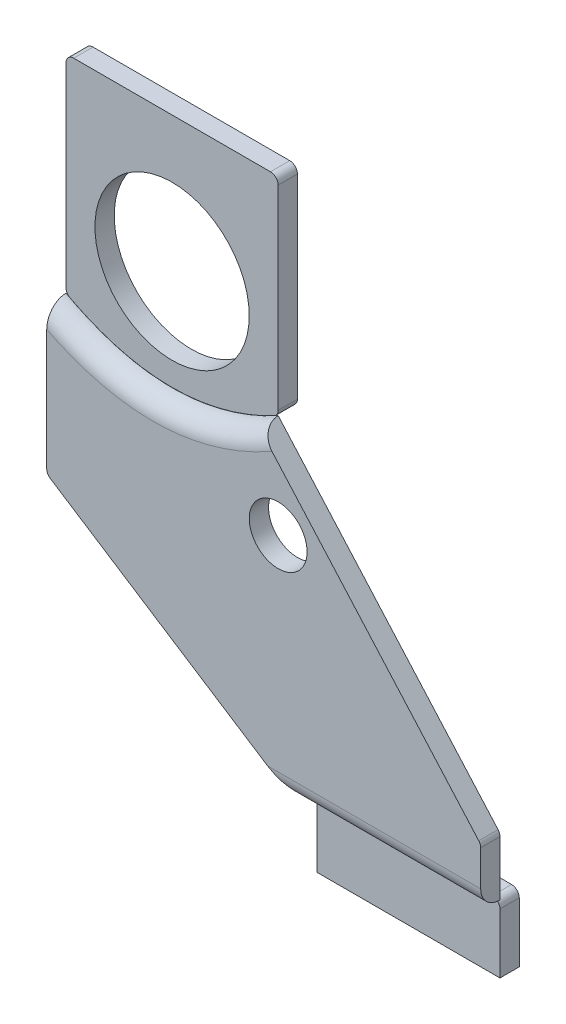
ISO-10303-21;
HEADER;
FILE_DESCRIPTION(('STEP AP214'),'2;1');
FILE_NAME('part.step','',(''),(''),'','','');
FILE_SCHEMA(('AUTOMOTIVE_DESIGN { 1 0 10303 214 1 1 1 1 }'));
ENDSEC;
DATA;
#1=APPLICATION_CONTEXT('core data for automotive mechanical design processes');
#2=APPLICATION_PROTOCOL_DEFINITION('international standard','automotive_design',2000,#1);
#3=PRODUCT_CONTEXT('',#1,'mechanical');
#4=PRODUCT('Part','Part','',(#3));
#5=PRODUCT_RELATED_PRODUCT_CATEGORY('part','',(#4));
#6=PRODUCT_DEFINITION_FORMATION('','',#4);
#7=PRODUCT_DEFINITION_CONTEXT('part definition',#1,'design');
#8=PRODUCT_DEFINITION('design','',#6,#7);
#9=PRODUCT_DEFINITION_SHAPE('','',#8);
#10=(LENGTH_UNIT() NAMED_UNIT(*) SI_UNIT(.MILLI.,.METRE.));
#11=(NAMED_UNIT(*) PLANE_ANGLE_UNIT() SI_UNIT($,.RADIAN.));
#12=(NAMED_UNIT(*) SI_UNIT($,.STERADIAN.) SOLID_ANGLE_UNIT());
#13=UNCERTAINTY_MEASURE_WITH_UNIT(LENGTH_MEASURE(1.E-05),#10,'distance_accuracy_value','');
#14=(GEOMETRIC_REPRESENTATION_CONTEXT(3) GLOBAL_UNCERTAINTY_ASSIGNED_CONTEXT((#13)) GLOBAL_UNIT_ASSIGNED_CONTEXT((#10,
#11,#12)) REPRESENTATION_CONTEXT('',''));
#15=CARTESIAN_POINT('',(0.,0.,0.));
#16=DIRECTION('',(0.,0.,1.));
#17=DIRECTION('',(1.,0.,0.));
#18=AXIS2_PLACEMENT_3D('',#15,#16,#17);
#19=CARTESIAN_POINT('',(-22.5,8.,0.));
#20=CARTESIAN_POINT('',(-11.5,2.054280429369,0.));
#21=CARTESIAN_POINT('',(-0.499999999999996,8.,0.));
#22=B_SPLINE_CURVE_WITH_KNOTS('',2,(#19,#20,#21),.UNSPECIFIED.,.F.,.F.,(3,3),(0.,1.),.UNSPECIFIED.);
#23=DIRECTION('',(0.,0.,-1.));
#24=VECTOR('',#23,1.);
#25=SURFACE_OF_LINEAR_EXTRUSION('',#22,#24);
#26=CARTESIAN_POINT('',(-22.5,8.,-2.));
#27=CARTESIAN_POINT('',(-11.5,2.054280429369,-2.));
#28=CARTESIAN_POINT('',(-0.499999999999996,8.,-2.));
#29=B_SPLINE_CURVE_WITH_KNOTS('',2,(#26,#27,#28),.UNSPECIFIED.,.F.,.F.,(3,3),(0.,1.),.UNSPECIFIED.);
#30=CARTESIAN_POINT('',(-22.0687060058506,7.77144719417887,-2.));
#31=VERTEX_POINT('',#30);
#32=CARTESIAN_POINT('',(-0.931293994149387,7.77144719417886,-2.));
#33=VERTEX_POINT('',#32);
#34=EDGE_CURVE('E137',#31,#33,#29,.T.);
#35=ORIENTED_EDGE('',*,*,#34,.T.);
#36=DIRECTION('',(0.,0.,-1.));
#37=VECTOR('',#36,1.);
#38=CARTESIAN_POINT('',(-0.931293994149414,7.77144719417885,-2.));
#39=LINE('',#38,#37);
#40=CARTESIAN_POINT('',(-0.931293994149387,7.77144719417886,0.));
#41=VERTEX_POINT('',#40);
#42=EDGE_CURVE('E114',#33,#41,#39,.F.);
#43=ORIENTED_EDGE('',*,*,#42,.T.);
#44=CARTESIAN_POINT('',(-22.0687060058506,7.77144719417887,0.));
#45=VERTEX_POINT('',#44);
#46=EDGE_CURVE('E149',#45,#41,#22,.T.);
#47=ORIENTED_EDGE('',*,*,#46,.F.);
#48=DIRECTION('',(0.,0.,-1.));
#49=VECTOR('',#48,1.);
#50=CARTESIAN_POINT('',(-22.0687060058506,7.77144719417885,0.));
#51=LINE('',#50,#49);
#52=EDGE_CURVE('E119',#45,#31,#51,.T.);
#53=ORIENTED_EDGE('',*,*,#52,.T.);
#54=EDGE_LOOP('',(#35,#43,#47,#53));
#55=FACE_BOUND('',#54,.T.);
#56=ADVANCED_FACE('F42',(#55),#25,.F.);
#57=CARTESIAN_POINT('',(-0.499999999999998,29.5,0.));
#58=DIRECTION('',(-1.,0.,0.));
#59=DIRECTION('',(0.,-1.,0.));
#60=AXIS2_PLACEMENT_3D('',#57,#58,#59);
#61=PLANE('',#60);
#62=DIRECTION('',(0.,1.,0.));
#63=VECTOR('',#62,1.);
#64=CARTESIAN_POINT('',(-0.499999999999998,29.5,0.));
#65=LINE('',#64,#63);
#66=CARTESIAN_POINT('',(-0.499999999999996,8.48141612395656,0.));
#67=VERTEX_POINT('',#66);
#68=CARTESIAN_POINT('',(-0.499999999999998,28.7,0.));
#69=VERTEX_POINT('',#68);
#70=EDGE_CURVE('E129',#67,#69,#65,.T.);
#71=ORIENTED_EDGE('',*,*,#70,.F.);
#72=DIRECTION('',(0.,0.,-1.));
#73=VECTOR('',#72,1.);
#74=CARTESIAN_POINT('',(-0.499999999999996,8.48141612395656,0.));
#75=LINE('',#74,#73);
#76=CARTESIAN_POINT('',(-0.499999999999996,8.48141612395656,-2.));
#77=VERTEX_POINT('',#76);
#78=EDGE_CURVE('E113',#67,#77,#75,.T.);
#79=ORIENTED_EDGE('',*,*,#78,.T.);
#80=DIRECTION('',(0.,1.,0.));
#81=VECTOR('',#80,1.);
#82=CARTESIAN_POINT('',(-0.499999999999998,29.5,-2.));
#83=LINE('',#82,#81);
#84=CARTESIAN_POINT('',(-0.499999999999998,28.7,-2.));
#85=VERTEX_POINT('',#84);
#86=EDGE_CURVE('E126',#77,#85,#83,.T.);
#87=ORIENTED_EDGE('',*,*,#86,.T.);
#88=DIRECTION('',(0.,0.,-1.));
#89=VECTOR('',#88,1.);
#90=CARTESIAN_POINT('',(-0.499999999999998,28.7,0.));
#91=LINE('',#90,#89);
#92=EDGE_CURVE('E131',#85,#69,#91,.F.);
#93=ORIENTED_EDGE('',*,*,#92,.T.);
#94=EDGE_LOOP('',(#71,#79,#87,#93));
#95=FACE_BOUND('',#94,.T.);
#96=ADVANCED_FACE('F125',(#95),#61,.F.);
#97=CARTESIAN_POINT('',(-22.5,29.5,0.));
#98=DIRECTION('',(0.,-1.,0.));
#99=DIRECTION('',(1.,0.,0.));
#100=AXIS2_PLACEMENT_3D('',#97,#98,#99);
#101=PLANE('',#100);
#102=DIRECTION('',(-1.,0.,0.));
#103=VECTOR('',#102,1.);
#104=CARTESIAN_POINT('',(-22.5,29.5,0.));
#105=LINE('',#104,#103);
#106=CARTESIAN_POINT('',(-1.3,29.5,0.));
#107=VERTEX_POINT('',#106);
#108=CARTESIAN_POINT('',(-21.7,29.5,0.));
#109=VERTEX_POINT('',#108);
#110=EDGE_CURVE('E172',#107,#109,#105,.T.);
#111=ORIENTED_EDGE('',*,*,#110,.F.);
#112=DIRECTION('',(0.,0.,-1.));
#113=VECTOR('',#112,1.);
#114=CARTESIAN_POINT('',(-1.3,29.5,0.));
#115=LINE('',#114,#113);
#116=CARTESIAN_POINT('',(-1.3,29.5,-2.));
#117=VERTEX_POINT('',#116);
#118=EDGE_CURVE('E12',#107,#117,#115,.T.);
#119=ORIENTED_EDGE('',*,*,#118,.T.);
#120=DIRECTION('',(-1.,0.,0.));
#121=VECTOR('',#120,1.);
#122=CARTESIAN_POINT('',(-22.5,29.5,-2.));
#123=LINE('',#122,#121);
#124=CARTESIAN_POINT('',(-21.7,29.5,-2.));
#125=VERTEX_POINT('',#124);
#126=EDGE_CURVE('E136',#117,#125,#123,.T.);
#127=ORIENTED_EDGE('',*,*,#126,.T.);
#128=DIRECTION('',(0.,0.,-1.));
#129=VECTOR('',#128,1.);
#130=CARTESIAN_POINT('',(-21.7,29.5,0.));
#131=LINE('',#130,#129);
#132=EDGE_CURVE('E50',#125,#109,#131,.F.);
#133=ORIENTED_EDGE('',*,*,#132,.T.);
#134=EDGE_LOOP('',(#111,#119,#127,#133));
#135=FACE_BOUND('',#134,.T.);
#136=ADVANCED_FACE('F171',(#135),#101,.F.);
#137=CARTESIAN_POINT('',(-22.5,8.,0.));
#138=DIRECTION('',(1.,0.,0.));
#139=DIRECTION('',(0.,0.,-1.));
#140=AXIS2_PLACEMENT_3D('',#137,#138,#139);
#141=PLANE('',#140);
#142=DIRECTION('',(0.,-1.,0.));
#143=VECTOR('',#142,1.);
#144=CARTESIAN_POINT('',(-22.5,8.,-2.));
#145=LINE('',#144,#143);
#146=CARTESIAN_POINT('',(-22.5,28.7,-2.));
#147=VERTEX_POINT('',#146);
#148=CARTESIAN_POINT('',(-22.5,8.48141612395656,-2.));
#149=VERTEX_POINT('',#148);
#150=EDGE_CURVE('E140',#147,#149,#145,.T.);
#151=ORIENTED_EDGE('',*,*,#150,.T.);
#152=DIRECTION('',(0.,0.,-1.));
#153=VECTOR('',#152,1.);
#154=CARTESIAN_POINT('',(-22.5,8.48141612395656,0.));
#155=LINE('',#154,#153);
#156=CARTESIAN_POINT('',(-22.5,8.48141612395656,0.));
#157=VERTEX_POINT('',#156);
#158=EDGE_CURVE('E57',#149,#157,#155,.F.);
#159=ORIENTED_EDGE('',*,*,#158,.T.);
#160=DIRECTION('',(0.,-1.,0.));
#161=VECTOR('',#160,1.);
#162=CARTESIAN_POINT('',(-22.5,8.,0.));
#163=LINE('',#162,#161);
#164=CARTESIAN_POINT('',(-22.5,28.7,0.));
#165=VERTEX_POINT('',#164);
#166=EDGE_CURVE('E150',#165,#157,#163,.T.);
#167=ORIENTED_EDGE('',*,*,#166,.F.);
#168=DIRECTION('',(0.,0.,-1.));
#169=VECTOR('',#168,1.);
#170=CARTESIAN_POINT('',(-22.5,28.7,0.));
#171=LINE('',#170,#169);
#172=EDGE_CURVE('E165',#165,#147,#171,.T.);
#173=ORIENTED_EDGE('',*,*,#172,.T.);
#174=EDGE_LOOP('',(#151,#159,#167,#173));
#175=FACE_BOUND('',#174,.T.);
#176=ADVANCED_FACE('F181',(#175),#141,.F.);
#177=CARTESIAN_POINT('',(-11.5,5.0271402146845,0.));
#178=DIRECTION('',(0.,0.,-1.));
#179=DIRECTION('',(-1.,0.,0.));
#180=AXIS2_PLACEMENT_3D('',#177,#178,#179);
#181=PLANE('',#180);
#182=CARTESIAN_POINT('',(-11.5,15.4633739660077,0.));
#183=DIRECTION('',(0.,0.,1.));
#184=DIRECTION('',(1.,0.,0.));
#185=AXIS2_PLACEMENT_3D('',#182,#183,#184);
#186=CIRCLE('',#185,8.);
#187=CARTESIAN_POINT('',(-3.49999999999999,15.4633739660077,0.));
#188=VERTEX_POINT('',#187);
#189=EDGE_CURVE('E194',#188,#188,#186,.T.);
#190=ORIENTED_EDGE('',*,*,#189,.F.);
#191=EDGE_LOOP('',(#190));
#192=FACE_BOUND('',#191,.T.);
#193=ORIENTED_EDGE('',*,*,#46,.T.);
#194=CARTESIAN_POINT('',(-1.3,8.48141612395656,0.));
#195=DIRECTION('',(0.,0.,-1.));
#196=DIRECTION('',(-1.,0.,0.));
#197=AXIS2_PLACEMENT_3D('',#194,#195,#196);
#198=CIRCLE('',#197,0.8);
#199=EDGE_CURVE('E163',#41,#67,#198,.F.);
#200=ORIENTED_EDGE('',*,*,#199,.T.);
#201=ORIENTED_EDGE('',*,*,#70,.T.);
#202=CARTESIAN_POINT('',(-1.3,28.7,0.));
#203=DIRECTION('',(0.,0.,-1.));
#204=DIRECTION('',(-1.,0.,0.));
#205=AXIS2_PLACEMENT_3D('',#202,#203,#204);
#206=CIRCLE('',#205,0.8);
#207=EDGE_CURVE('E159',#69,#107,#206,.F.);
#208=ORIENTED_EDGE('',*,*,#207,.T.);
#209=ORIENTED_EDGE('',*,*,#110,.T.);
#210=CARTESIAN_POINT('',(-21.7,28.7,0.));
#211=DIRECTION('',(0.,0.,-1.));
#212=DIRECTION('',(-1.,0.,0.));
#213=AXIS2_PLACEMENT_3D('',#210,#211,#212);
#214=CIRCLE('',#213,0.8);
#215=EDGE_CURVE('E64',#109,#165,#214,.F.);
#216=ORIENTED_EDGE('',*,*,#215,.T.);
#217=ORIENTED_EDGE('',*,*,#166,.T.);
#218=CARTESIAN_POINT('',(-21.7,8.48141612395656,0.));
#219=DIRECTION('',(0.,0.,-1.));
#220=DIRECTION('',(-1.,0.,0.));
#221=AXIS2_PLACEMENT_3D('',#218,#219,#220);
#222=CIRCLE('',#221,0.8);
#223=EDGE_CURVE('E161',#157,#45,#222,.F.);
#224=ORIENTED_EDGE('',*,*,#223,.T.);
#225=EDGE_LOOP('',(#193,#200,#201,#208,#209,#216,#217,#224));
#226=FACE_BOUND('',#225,.T.);
#227=ADVANCED_FACE('F176',(#192,#226),#181,.F.);
#228=CARTESIAN_POINT('',(-11.5,5.0271402146845,-2.));
#229=DIRECTION('',(0.,0.,-1.));
#230=DIRECTION('',(-1.,0.,0.));
#231=AXIS2_PLACEMENT_3D('',#228,#229,#230);
#232=PLANE('',#231);
#233=CARTESIAN_POINT('',(-11.5,15.4633739660077,-2.));
#234=DIRECTION('',(0.,0.,1.));
#235=DIRECTION('',(1.,0.,0.));
#236=AXIS2_PLACEMENT_3D('',#233,#234,#235);
#237=CIRCLE('',#236,8.);
#238=CARTESIAN_POINT('',(-3.49999999999999,15.4633739660077,-2.));
#239=VERTEX_POINT('',#238);
#240=EDGE_CURVE('E142',#239,#239,#237,.T.);
#241=ORIENTED_EDGE('',*,*,#240,.T.);
#242=EDGE_LOOP('',(#241));
#243=FACE_BOUND('',#242,.T.);
#244=ORIENTED_EDGE('',*,*,#86,.F.);
#245=CARTESIAN_POINT('',(-1.3,8.48141612395656,-2.));
#246=DIRECTION('',(0.,0.,-1.));
#247=DIRECTION('',(-1.,0.,0.));
#248=AXIS2_PLACEMENT_3D('',#245,#246,#247);
#249=CIRCLE('',#248,0.8);
#250=EDGE_CURVE('E109',#77,#33,#249,.T.);
#251=ORIENTED_EDGE('',*,*,#250,.T.);
#252=ORIENTED_EDGE('',*,*,#34,.F.);
#253=CARTESIAN_POINT('',(-21.7,8.48141612395656,-2.));
#254=DIRECTION('',(0.,0.,-1.));
#255=DIRECTION('',(-1.,0.,0.));
#256=AXIS2_PLACEMENT_3D('',#253,#254,#255);
#257=CIRCLE('',#256,0.8);
#258=EDGE_CURVE('E120',#31,#149,#257,.T.);
#259=ORIENTED_EDGE('',*,*,#258,.T.);
#260=ORIENTED_EDGE('',*,*,#150,.F.);
#261=CARTESIAN_POINT('',(-21.7,28.7,-2.));
#262=DIRECTION('',(0.,0.,-1.));
#263=DIRECTION('',(-1.,0.,0.));
#264=AXIS2_PLACEMENT_3D('',#261,#262,#263);
#265=CIRCLE('',#264,0.8);
#266=EDGE_CURVE('E130',#147,#125,#265,.T.);
#267=ORIENTED_EDGE('',*,*,#266,.T.);
#268=ORIENTED_EDGE('',*,*,#126,.F.);
#269=CARTESIAN_POINT('',(-1.3,28.7,-2.));
#270=DIRECTION('',(0.,0.,-1.));
#271=DIRECTION('',(-1.,0.,0.));
#272=AXIS2_PLACEMENT_3D('',#269,#270,#271);
#273=CIRCLE('',#272,0.8);
#274=EDGE_CURVE('E135',#117,#85,#273,.T.);
#275=ORIENTED_EDGE('',*,*,#274,.T.);
#276=EDGE_LOOP('',(#244,#251,#252,#259,#260,#267,#268,#275));
#277=FACE_BOUND('',#276,.T.);
#278=ADVANCED_FACE('F133',(#243,#277),#232,.T.);
#279=CARTESIAN_POINT('',(-11.5,15.4633739660077,-2.));
#280=DIRECTION('',(0.,0.,1.));
#281=DIRECTION('',(1.,0.,0.));
#282=AXIS2_PLACEMENT_3D('',#279,#280,#281);
#283=CYLINDRICAL_SURFACE('',#282,8.);
#284=ORIENTED_EDGE('',*,*,#240,.F.);
#285=EDGE_LOOP('',(#284));
#286=FACE_BOUND('',#285,.T.);
#287=ORIENTED_EDGE('',*,*,#189,.T.);
#288=EDGE_LOOP('',(#287));
#289=FACE_BOUND('',#288,.T.);
#290=ADVANCED_FACE('F206',(#286,#289),#283,.F.);
#291=CARTESIAN_POINT('',(-1.3,8.48141612395656,-1.));
#292=DIRECTION('',(0.,0.,-1.));
#293=DIRECTION('',(-1.,0.,0.));
#294=AXIS2_PLACEMENT_3D('',#291,#292,#293);
#295=CYLINDRICAL_SURFACE('',#294,0.8);
#296=ORIENTED_EDGE('',*,*,#199,.F.);
#297=ORIENTED_EDGE('',*,*,#42,.F.);
#298=ORIENTED_EDGE('',*,*,#250,.F.);
#299=ORIENTED_EDGE('',*,*,#78,.F.);
#300=EDGE_LOOP('',(#296,#297,#298,#299));
#301=FACE_BOUND('',#300,.T.);
#302=ADVANCED_FACE('F112',(#301),#295,.T.);
#303=CARTESIAN_POINT('',(-21.7,8.48141612395656,-1.));
#304=DIRECTION('',(0.,0.,-1.));
#305=DIRECTION('',(-1.,0.,0.));
#306=AXIS2_PLACEMENT_3D('',#303,#304,#305);
#307=CYLINDRICAL_SURFACE('',#306,0.8);
#308=ORIENTED_EDGE('',*,*,#223,.F.);
#309=ORIENTED_EDGE('',*,*,#158,.F.);
#310=ORIENTED_EDGE('',*,*,#258,.F.);
#311=ORIENTED_EDGE('',*,*,#52,.F.);
#312=EDGE_LOOP('',(#308,#309,#310,#311));
#313=FACE_BOUND('',#312,.T.);
#314=ADVANCED_FACE('F185',(#313),#307,.T.);
#315=CARTESIAN_POINT('',(-1.3,28.7,0.));
#316=DIRECTION('',(0.,0.,-1.));
#317=DIRECTION('',(-1.,0.,0.));
#318=AXIS2_PLACEMENT_3D('',#315,#316,#317);
#319=CYLINDRICAL_SURFACE('',#318,0.8);
#320=ORIENTED_EDGE('',*,*,#207,.F.);
#321=ORIENTED_EDGE('',*,*,#92,.F.);
#322=ORIENTED_EDGE('',*,*,#274,.F.);
#323=ORIENTED_EDGE('',*,*,#118,.F.);
#324=EDGE_LOOP('',(#320,#321,#322,#323));
#325=FACE_BOUND('',#324,.T.);
#326=ADVANCED_FACE('F208',(#325),#319,.T.);
#327=CARTESIAN_POINT('',(-21.7,28.7,0.));
#328=DIRECTION('',(0.,0.,-1.));
#329=DIRECTION('',(-1.,0.,0.));
#330=AXIS2_PLACEMENT_3D('',#327,#328,#329);
#331=CYLINDRICAL_SURFACE('',#330,0.8);
#332=ORIENTED_EDGE('',*,*,#215,.F.);
#333=ORIENTED_EDGE('',*,*,#132,.F.);
#334=ORIENTED_EDGE('',*,*,#266,.F.);
#335=ORIENTED_EDGE('',*,*,#172,.F.);
#336=EDGE_LOOP('',(#332,#333,#334,#335));
#337=FACE_BOUND('',#336,.T.);
#338=ADVANCED_FACE('F44',(#337),#331,.T.);
#339=CLOSED_SHELL('',(#56,#96,#136,#176,#227,#278,#290,#302,#314,#326,#338));
#340=MANIFOLD_SOLID_BREP('B2',#339);
#341=CARTESIAN_POINT('',(22.5,-24.,0.));
#342=DIRECTION('',(0.,-1.,0.));
#343=DIRECTION('',(0.,0.,-1.));
#344=AXIS2_PLACEMENT_3D('',#341,#342,#343);
#345=PLANE('',#344);
#346=DIRECTION('',(-1.,0.,0.));
#347=VECTOR('',#346,1.);
#348=CARTESIAN_POINT('',(22.5,-24.,-2.));
#349=LINE('',#348,#347);
#350=CARTESIAN_POINT('',(21.7,-24.,-2.));
#351=VERTEX_POINT('',#350);
#352=CARTESIAN_POINT('',(4.30000000000001,-24.,-2.));
#353=VERTEX_POINT('',#352);
#354=EDGE_CURVE('E394',#351,#353,#349,.T.);
#355=ORIENTED_EDGE('',*,*,#354,.T.);
#356=DIRECTION('',(0.,0.,-1.));
#357=VECTOR('',#356,1.);
#358=CARTESIAN_POINT('',(4.30000000000001,-24.,0.));
#359=LINE('',#358,#357);
#360=CARTESIAN_POINT('',(4.30000000000001,-24.,0.));
#361=VERTEX_POINT('',#360);
#362=EDGE_CURVE('E332',#353,#361,#359,.F.);
#363=ORIENTED_EDGE('',*,*,#362,.T.);
#364=DIRECTION('',(-1.,0.,0.));
#365=VECTOR('',#364,1.);
#366=CARTESIAN_POINT('',(22.5,-24.,0.));
#367=LINE('',#366,#365);
#368=CARTESIAN_POINT('',(21.7,-24.,0.));
#369=VERTEX_POINT('',#368);
#370=EDGE_CURVE('E375',#369,#361,#367,.T.);
#371=ORIENTED_EDGE('',*,*,#370,.F.);
#372=DIRECTION('',(0.,0.,-1.));
#373=VECTOR('',#372,1.);
#374=CARTESIAN_POINT('',(21.7,-24.,0.));
#375=LINE('',#374,#373);
#376=EDGE_CURVE('E407',#369,#351,#375,.T.);
#377=ORIENTED_EDGE('',*,*,#376,.T.);
#378=EDGE_LOOP('',(#355,#363,#371,#377));
#379=FACE_BOUND('',#378,.T.);
#380=ADVANCED_FACE('F311',(#379),#345,.F.);
#381=CARTESIAN_POINT('',(3.50000000000001,-24.,0.));
#382=DIRECTION('',(1.,0.,0.));
#383=DIRECTION('',(0.,1.,0.));
#384=AXIS2_PLACEMENT_3D('',#381,#382,#383);
#385=PLANE('',#384);
#386=DIRECTION('',(0.,-1.,0.));
#387=VECTOR('',#386,1.);
#388=CARTESIAN_POINT('',(3.50000000000001,-24.,0.));
#389=LINE('',#388,#387);
#390=CARTESIAN_POINT('',(3.50000000000001,-24.8,0.));
#391=VERTEX_POINT('',#390);
#392=CARTESIAN_POINT('',(3.50000000000001,-31.,0.));
#393=VERTEX_POINT('',#392);
#394=EDGE_CURVE('E365',#391,#393,#389,.T.);
#395=ORIENTED_EDGE('',*,*,#394,.F.);
#396=DIRECTION('',(0.,0.,-1.));
#397=VECTOR('',#396,1.);
#398=CARTESIAN_POINT('',(3.50000000000001,-24.8,0.));
#399=LINE('',#398,#397);
#400=CARTESIAN_POINT('',(3.50000000000001,-24.8,-2.));
#401=VERTEX_POINT('',#400);
#402=EDGE_CURVE('E384',#391,#401,#399,.T.);
#403=ORIENTED_EDGE('',*,*,#402,.T.);
#404=DIRECTION('',(0.,-1.,0.));
#405=VECTOR('',#404,1.);
#406=CARTESIAN_POINT('',(3.50000000000001,-24.,-2.));
#407=LINE('',#406,#405);
#408=CARTESIAN_POINT('',(3.50000000000001,-31.,-2.));
#409=VERTEX_POINT('',#408);
#410=EDGE_CURVE('E381',#401,#409,#407,.T.);
#411=ORIENTED_EDGE('',*,*,#410,.T.);
#412=DIRECTION('',(0.,0.,-1.));
#413=VECTOR('',#412,1.);
#414=CARTESIAN_POINT('',(3.50000000000001,-31.,0.));
#415=LINE('',#414,#413);
#416=EDGE_CURVE('E378',#393,#409,#415,.T.);
#417=ORIENTED_EDGE('',*,*,#416,.F.);
#418=EDGE_LOOP('',(#395,#403,#411,#417));
#419=FACE_BOUND('',#418,.T.);
#420=ADVANCED_FACE('F379',(#419),#385,.F.);
#421=CARTESIAN_POINT('',(3.50000000000001,-31.,0.));
#422=DIRECTION('',(0.,1.,0.));
#423=DIRECTION('',(0.,0.,1.));
#424=AXIS2_PLACEMENT_3D('',#421,#422,#423);
#425=PLANE('',#424);
#426=DIRECTION('',(1.,0.,0.));
#427=VECTOR('',#426,1.);
#428=CARTESIAN_POINT('',(3.50000000000001,-31.,-2.));
#429=LINE('',#428,#427);
#430=CARTESIAN_POINT('',(22.5,-31.,-2.));
#431=VERTEX_POINT('',#430);
#432=EDGE_CURVE('E397',#409,#431,#429,.T.);
#433=ORIENTED_EDGE('',*,*,#432,.T.);
#434=DIRECTION('',(0.,0.,-1.));
#435=VECTOR('',#434,1.);
#436=CARTESIAN_POINT('',(22.5,-31.,0.));
#437=LINE('',#436,#435);
#438=CARTESIAN_POINT('',(22.5,-31.,0.));
#439=VERTEX_POINT('',#438);
#440=EDGE_CURVE('E385',#439,#431,#437,.T.);
#441=ORIENTED_EDGE('',*,*,#440,.F.);
#442=DIRECTION('',(1.,0.,0.));
#443=VECTOR('',#442,1.);
#444=CARTESIAN_POINT('',(3.50000000000001,-31.,0.));
#445=LINE('',#444,#443);
#446=EDGE_CURVE('E369',#393,#439,#445,.T.);
#447=ORIENTED_EDGE('',*,*,#446,.F.);
#448=ORIENTED_EDGE('',*,*,#416,.T.);
#449=EDGE_LOOP('',(#433,#441,#447,#448));
#450=FACE_BOUND('',#449,.T.);
#451=ADVANCED_FACE('F387',(#450),#425,.F.);
#452=CARTESIAN_POINT('',(22.5,-31.,0.));
#453=DIRECTION('',(-1.,0.,0.));
#454=DIRECTION('',(0.,0.,1.));
#455=AXIS2_PLACEMENT_3D('',#452,#453,#454);
#456=PLANE('',#455);
#457=DIRECTION('',(0.,1.,0.));
#458=VECTOR('',#457,1.);
#459=CARTESIAN_POINT('',(22.5,-31.,-2.));
#460=LINE('',#459,#458);
#461=CARTESIAN_POINT('',(22.5,-24.8,-2.));
#462=VERTEX_POINT('',#461);
#463=EDGE_CURVE('E399',#431,#462,#460,.T.);
#464=ORIENTED_EDGE('',*,*,#463,.T.);
#465=DIRECTION('',(0.,0.,-1.));
#466=VECTOR('',#465,1.);
#467=CARTESIAN_POINT('',(22.5,-24.8,0.));
#468=LINE('',#467,#466);
#469=CARTESIAN_POINT('',(22.5,-24.8,0.));
#470=VERTEX_POINT('',#469);
#471=EDGE_CURVE('E40',#462,#470,#468,.F.);
#472=ORIENTED_EDGE('',*,*,#471,.T.);
#473=DIRECTION('',(0.,1.,0.));
#474=VECTOR('',#473,1.);
#475=CARTESIAN_POINT('',(22.5,-31.,0.));
#476=LINE('',#475,#474);
#477=EDGE_CURVE('E389',#439,#470,#476,.T.);
#478=ORIENTED_EDGE('',*,*,#477,.F.);
#479=ORIENTED_EDGE('',*,*,#440,.T.);
#480=EDGE_LOOP('',(#464,#472,#478,#479));
#481=FACE_BOUND('',#480,.T.);
#482=ADVANCED_FACE('F419',(#481),#456,.F.);
#483=CARTESIAN_POINT('',(3.50000000000001,-24.,0.));
#484=DIRECTION('',(0.,0.,1.));
#485=DIRECTION('',(1.,0.,0.));
#486=AXIS2_PLACEMENT_3D('',#483,#484,#485);
#487=PLANE('',#486);
#488=ORIENTED_EDGE('',*,*,#370,.T.);
#489=CARTESIAN_POINT('',(4.30000000000001,-24.8,0.));
#490=DIRECTION('',(0.,0.,1.));
#491=DIRECTION('',(1.,0.,0.));
#492=AXIS2_PLACEMENT_3D('',#489,#490,#491);
#493=CIRCLE('',#492,0.8);
#494=EDGE_CURVE('E319',#361,#391,#493,.T.);
#495=ORIENTED_EDGE('',*,*,#494,.T.);
#496=ORIENTED_EDGE('',*,*,#394,.T.);
#497=ORIENTED_EDGE('',*,*,#446,.T.);
#498=ORIENTED_EDGE('',*,*,#477,.T.);
#499=CARTESIAN_POINT('',(21.7,-24.8,0.));
#500=DIRECTION('',(0.,0.,1.));
#501=DIRECTION('',(1.,0.,0.));
#502=AXIS2_PLACEMENT_3D('',#499,#500,#501);
#503=CIRCLE('',#502,0.8);
#504=EDGE_CURVE('E411',#470,#369,#503,.T.);
#505=ORIENTED_EDGE('',*,*,#504,.T.);
#506=EDGE_LOOP('',(#488,#495,#496,#497,#498,#505));
#507=FACE_BOUND('',#506,.T.);
#508=ADVANCED_FACE('F367',(#507),#487,.T.);
#509=CARTESIAN_POINT('',(3.50000000000001,-24.,-2.));
#510=DIRECTION('',(0.,0.,1.));
#511=DIRECTION('',(1.,0.,0.));
#512=AXIS2_PLACEMENT_3D('',#509,#510,#511);
#513=PLANE('',#512);
#514=ORIENTED_EDGE('',*,*,#410,.F.);
#515=CARTESIAN_POINT('',(4.30000000000001,-24.8,-2.));
#516=DIRECTION('',(0.,0.,1.));
#517=DIRECTION('',(1.,0.,0.));
#518=AXIS2_PLACEMENT_3D('',#515,#516,#517);
#519=CIRCLE('',#518,0.8);
#520=EDGE_CURVE('E405',#401,#353,#519,.F.);
#521=ORIENTED_EDGE('',*,*,#520,.T.);
#522=ORIENTED_EDGE('',*,*,#354,.F.);
#523=CARTESIAN_POINT('',(21.7,-24.8,-2.));
#524=DIRECTION('',(0.,0.,1.));
#525=DIRECTION('',(1.,0.,0.));
#526=AXIS2_PLACEMENT_3D('',#523,#524,#525);
#527=CIRCLE('',#526,0.8);
#528=EDGE_CURVE('E403',#351,#462,#527,.F.);
#529=ORIENTED_EDGE('',*,*,#528,.T.);
#530=ORIENTED_EDGE('',*,*,#463,.F.);
#531=ORIENTED_EDGE('',*,*,#432,.F.);
#532=EDGE_LOOP('',(#514,#521,#522,#529,#530,#531));
#533=FACE_BOUND('',#532,.T.);
#534=ADVANCED_FACE('F418',(#533),#513,.F.);
#535=CARTESIAN_POINT('',(4.30000000000001,-24.8,0.));
#536=DIRECTION('',(0.,0.,-1.));
#537=DIRECTION('',(-1.,0.,0.));
#538=AXIS2_PLACEMENT_3D('',#535,#536,#537);
#539=CYLINDRICAL_SURFACE('',#538,0.8);
#540=ORIENTED_EDGE('',*,*,#494,.F.);
#541=ORIENTED_EDGE('',*,*,#362,.F.);
#542=ORIENTED_EDGE('',*,*,#520,.F.);
#543=ORIENTED_EDGE('',*,*,#402,.F.);
#544=EDGE_LOOP('',(#540,#541,#542,#543));
#545=FACE_BOUND('',#544,.T.);
#546=ADVANCED_FACE('F435',(#545),#539,.T.);
#547=CARTESIAN_POINT('',(21.7,-24.8,0.));
#548=DIRECTION('',(0.,0.,-1.));
#549=DIRECTION('',(-1.,0.,0.));
#550=AXIS2_PLACEMENT_3D('',#547,#548,#549);
#551=CYLINDRICAL_SURFACE('',#550,0.8);
#552=ORIENTED_EDGE('',*,*,#504,.F.);
#553=ORIENTED_EDGE('',*,*,#471,.F.);
#554=ORIENTED_EDGE('',*,*,#528,.F.);
#555=ORIENTED_EDGE('',*,*,#376,.F.);
#556=EDGE_LOOP('',(#552,#553,#554,#555));
#557=FACE_BOUND('',#556,.T.);
#558=ADVANCED_FACE('F313',(#557),#551,.T.);
#559=CLOSED_SHELL('',(#380,#420,#451,#482,#508,#534,#546,#558));
#560=MANIFOLD_SOLID_BREP('B6',#559);
#561=CARTESIAN_POINT('',(22.5,-18.,2.));
#562=DIRECTION('',(-0.748996562490381,-0.662573882203029,0.));
#563=DIRECTION('',(0.662573882203029,-0.748996562490381,0.));
#564=AXIS2_PLACEMENT_3D('',#561,#562,#563);
#565=PLANE('',#564);
#566=DIRECTION('',(-0.662573882203029,0.748996562490381,0.));
#567=VECTOR('',#566,1.);
#568=CARTESIAN_POINT('',(22.5,-18.,2.));
#569=LINE('',#568,#567);
#570=CARTESIAN_POINT('',(22.2991972499923,-17.7730055869478,2.));
#571=VERTEX_POINT('',#570);
#572=CARTESIAN_POINT('',(0.859382896138013,6.46330629132225,2.));
#573=VERTEX_POINT('',#572);
#574=EDGE_CURVE('E665',#571,#573,#569,.T.);
#575=ORIENTED_EDGE('',*,*,#574,.F.);
#576=DIRECTION('',(0.,0.,-1.));
#577=VECTOR('',#576,1.);
#578=CARTESIAN_POINT('',(22.2991972499923,-17.7730055869478,2.));
#579=LINE('',#578,#577);
#580=CARTESIAN_POINT('',(22.2991972499923,-17.7730055869478,0.));
#581=VERTEX_POINT('',#580);
#582=EDGE_CURVE('E560',#571,#581,#579,.T.);
#583=ORIENTED_EDGE('',*,*,#582,.T.);
#584=DIRECTION('',(-0.662573882203029,0.748996562490381,0.));
#585=VECTOR('',#584,1.);
#586=CARTESIAN_POINT('',(22.5,-18.,0.));
#587=LINE('',#586,#585);
#588=CARTESIAN_POINT('',(-0.499999999999996,8.,0.));
#589=VERTEX_POINT('',#588);
#590=EDGE_CURVE('E553',#581,#589,#587,.T.);
#591=ORIENTED_EDGE('',*,*,#590,.T.);
#592=CARTESIAN_POINT('',(-27.608913482189,8.50850479280463,2.));
#593=CARTESIAN_POINT('',(-26.6512092208279,10.2642959386334,2.));
#594=CARTESIAN_POINT('',(-26.6512092208279,10.2642959386334,0.));
#595=CARTESIAN_POINT('',(-26.2251770756165,7.75373948021891,2.));
#596=CARTESIAN_POINT('',(-25.2674728142554,9.50953062604768,2.));
#597=CARTESIAN_POINT('',(-25.2674728142933,9.50953062597817,0.));
#598=CARTESIAN_POINT('',(-24.841440669044,6.99897416763319,2.));
#599=CARTESIAN_POINT('',(-23.8837364076829,8.75476531346196,2.));
#600=CARTESIAN_POINT('',(-23.8837364077587,8.75476531332294,0.));
#601=CARTESIAN_POINT('',(-23.4577042624715,6.24420885504747,2.));
#602=CARTESIAN_POINT('',(-22.5000000011104,8.00000000087624,2.));
#603=CARTESIAN_POINT('',(-22.5000000012241,8.0000000006677,0.));
#604=CARTESIAN_POINT('',(-22.9221996088638,5.95208462206322,2.));
#605=CARTESIAN_POINT('',(-21.9981421969965,7.72622211554668,2.));
#606=CARTESIAN_POINT('',(-21.9981421970378,7.72622211547108,0.));
#607=CARTESIAN_POINT('',(-22.3781175852302,5.67533367483731,2.));
#608=CARTESIAN_POINT('',(-21.4897822670003,7.46770622792561,2.));
#609=CARTESIAN_POINT('',(-21.4897822670115,7.46770622790518,0.));
#610=CARTESIAN_POINT('',(-21.2707193481386,5.15503019252701,2.));
#611=CARTESIAN_POINT('',(-20.4582453194136,6.98305094723714,2.));
#612=CARTESIAN_POINT('',(-20.4582453194024,6.98305094725768,0.));
#613=CARTESIAN_POINT('',(-20.7073145284214,4.91166664710669,2.));
#614=CARTESIAN_POINT('',(-19.9350026897306,6.75709552731822,2.));
#615=CARTESIAN_POINT('',(-19.9350026897273,6.75709552732419,0.));
#616=CARTESIAN_POINT('',(-19.4489762287281,4.41835461884649,2.));
#617=CARTESIAN_POINT('',(-18.7699081357621,6.30033486450506,2.));
#618=CARTESIAN_POINT('',(-18.769908135766,6.30033486449787,0.));
#619=CARTESIAN_POINT('',(-18.7505813403922,4.17711860085265,2.));
#620=CARTESIAN_POINT('',(-18.1255616385801,6.07787576122473,2.));
#621=CARTESIAN_POINT('',(-18.1255616385811,6.0778757612228,0.));
#622=CARTESIAN_POINT('',(-17.3347919297989,3.75767751403453,2.));
#623=CARTESIAN_POINT('',(-16.8235867180525,5.69215084776828,2.));
#624=CARTESIAN_POINT('',(-16.8235867180514,5.6921508477702,0.));
#625=CARTESIAN_POINT('',(-16.6173922453411,3.57948976343249,2.));
#626=CARTESIAN_POINT('',(-16.1659546977691,5.52890130108179,2.));
#627=CARTESIAN_POINT('',(-16.1659546977688,5.5289013010823,0.));
#628=CARTESIAN_POINT('',(-15.1702347432903,3.29219904059125,2.));
#629=CARTESIAN_POINT('',(-14.8426401449453,5.26619277931873,2.));
#630=CARTESIAN_POINT('',(-14.8426401449456,5.26619277931822,0.));
#631=CARTESIAN_POINT('',(-14.4405041102565,3.18296041576238,2.));
#632=CARTESIAN_POINT('',(-14.1769760625811,5.16660854218437,2.));
#633=CARTESIAN_POINT('',(-14.1769760625812,5.16660854218425,0.));
#634=CARTESIAN_POINT('',(-12.9738576991251,3.03686210847005,2.));
#635=CARTESIAN_POINT('',(-12.8408828724438,5.03351365309091,2.));
#636=CARTESIAN_POINT('',(-12.8408828724438,5.03351365309103,0.));
#637=CARTESIAN_POINT('',(-12.2369426437537,2.99999521965836,2.));
#638=CARTESIAN_POINT('',(-12.1704542457685,4.99999642256977,2.));
#639=CARTESIAN_POINT('',(-12.1704542457685,4.99999642256975,0.));
#640=CARTESIAN_POINT('',(-10.7230301934978,3.00000503998669,2.));
#641=CARTESIAN_POINT('',(-10.7931299841421,5.00000377173894,2.));
#642=CARTESIAN_POINT('',(-10.7931299841422,5.00000377173897,0.));
#643=CARTESIAN_POINT('',(-9.94602972028856,3.04099590734915,2.));
#644=CARTESIAN_POINT('',(-10.0862314940887,5.03726861897945,2.));
#645=CARTESIAN_POINT('',(-10.0862314940888,5.0372686189797,0.));
#646=CARTESIAN_POINT('',(-8.40039190313429,3.20330277203351,2.));
#647=CARTESIAN_POINT('',(-8.67797159232944,5.18515256389795,2.));
#648=CARTESIAN_POINT('',(-8.6779715923293,5.18515256389771,0.));
#649=CARTESIAN_POINT('',(-7.63175640783163,3.32463617264117,2.));
#650=CARTESIAN_POINT('',(-7.97661141361315,5.29578755455514,2.));
#651=CARTESIAN_POINT('',(-7.97661141361262,5.29578755455418,0.));
#652=CARTESIAN_POINT('',(-6.10891945146323,3.64323555594257,2.));
#653=CARTESIAN_POINT('',(-6.58334783419077,5.58728209818982,2.));
#654=CARTESIAN_POINT('',(-6.5833478341913,5.58728209819078,0.));
#655=CARTESIAN_POINT('',(-5.35475049046645,3.84065531717354,2.));
#656=CARTESIAN_POINT('',(-5.89146654306508,5.7682838763448,2.));
#657=CARTESIAN_POINT('',(-5.89146654306706,5.76828387634843,0.));
#658=CARTESIAN_POINT('',(-3.86835242793988,4.30446506135374,2.));
#659=CARTESIAN_POINT('',(-4.52311889232237,6.1952614924349,2.));
#660=CARTESIAN_POINT('',(-4.5231188923204,6.19526149243128,0.));
#661=CARTESIAN_POINT('',(-3.13611564459042,4.57083057304913,2.));
#662=CARTESIAN_POINT('',(-3.84664715581676,6.44121427761589,2.));
#663=CARTESIAN_POINT('',(-3.84664715580939,6.44121427760238,0.));
#664=CARTESIAN_POINT('',(-1.92406720432001,5.0708922141151,2.));
#665=CARTESIAN_POINT('',(-2.72265738309224,6.90494709302875,2.));
#666=CARTESIAN_POINT('',(-2.72265738309729,6.904947093038,0.));
#667=CARTESIAN_POINT('',(-1.437462668802,5.28840715077294,2.));
#668=CARTESIAN_POINT('',(-2.27020305965879,7.10715754100489,2.));
#669=CARTESIAN_POINT('',(-2.27020305967487,7.10715754103436,0.));
#670=CARTESIAN_POINT('',(-0.479247883542003,5.74823650594507,2.));
#671=CARTESIAN_POINT('',(-1.37691450095353,7.53582659964693,2.));
#672=CARTESIAN_POINT('',(-1.37691450093754,7.53582659961761,0.));
#673=CARTESIAN_POINT('',(-0.00757214392614702,5.99041423298641,2.));
#674=CARTESIAN_POINT('',(-0.936031604614881,7.76215184821567,2.));
#675=CARTESIAN_POINT('',(-0.936031604556077,7.76215184810787,0.));
#676=CARTESIAN_POINT('',(0.457704255256485,6.2442088512244,2.));
#677=CARTESIAN_POINT('',(-0.500000076669812,7.99999995856309,2.));
#678=CARTESIAN_POINT('',(-0.500000076508809,7.99999995826791,0.));
#679=CARTESIAN_POINT('',(1.84144066423401,6.99897416508448,2.));
#680=CARTESIAN_POINT('',(0.88373635582943,8.75476528525319,2.));
#681=CARTESIAN_POINT('',(0.883736355936765,8.75476528505641,0.));
#682=CARTESIAN_POINT('',(3.22517707321154,7.75373947894456,2.));
#683=CARTESIAN_POINT('',(2.26747278832867,9.5095306119433,2.));
#684=CARTESIAN_POINT('',(2.26747278838234,9.50953061184491,0.));
#685=CARTESIAN_POINT('',(4.60891348218906,8.50850479280463,2.));
#686=CARTESIAN_POINT('',(3.65120922082791,10.2642959386334,2.));
#687=CARTESIAN_POINT('',(3.65120922082791,10.2642959386334,0.));
#688=(BOUNDED_SURFACE() B_SPLINE_SURFACE(3,2,((#592,#593,#594),(#595,#596,#597),(#598,#599,
#600),(#601,#602,#603),(#604,#605,#606),(#607,#608,#609),(#610,#611,#612),(#613,#614,#615),
(#616,#617,#618),(#619,#620,#621),(#622,#623,#624),(#625,#626,#627),(#628,#629,#630),(#631,#632,
#633),(#634,#635,#636),(#637,#638,#639),(#640,#641,#642),(#643,#644,#645),(#646,#647,#648),
(#649,#650,#651),(#652,#653,#654),(#655,#656,#657),(#658,#659,#660),(#661,#662,#663),(#664,#665,
#666),(#667,#668,#669),(#670,#671,#672),(#673,#674,#675),(#676,#677,#678),(#679,#680,#681),
(#682,#683,#684),(#685,#686,#687)),.UNSPECIFIED.,.F.,.F.,.F.) B_SPLINE_SURFACE_WITH_KNOTS((4,3,
2,2,2,2,2,2,2,2,2,2,2,3,4),(3,3),(0.,4.72859113051777,6.55857155014344,8.39851718296286,
10.6123793268515,12.826849107534,15.036948380551,17.2468275738255,19.576736724483,
21.9071507303329,24.2422996592158,26.5766208960492,28.1749071143812,29.764772890346,
34.4933640290285),(0.,1.),
.UNSPECIFIED.) GEOMETRIC_REPRESENTATION_ITEM() RATIONAL_B_SPLINE_SURFACE(((1.,0.707106781186548,
1.),(1.,0.707106781186548,1.),(1.,0.707106781186548,1.),(1.,0.707106781186548,1.),(1.,
0.707106781186548,1.),(1.,0.707106781186548,1.),(1.,0.707106781186548,1.),(1.,0.707106781186548,
1.),(1.,0.707106781186548,1.),(1.,0.707106781186548,1.),(1.,0.707106781186548,1.),(1.,
0.707106781186548,1.),(1.,0.707106781186548,1.),(1.,0.707106781186548,1.),(1.,0.707106781186548,
1.),(1.,0.707106781186548,1.),(1.,0.707106781186548,1.),(1.,0.707106781186548,1.),(1.,
0.707106781186548,1.),(1.,0.707106781186548,1.),(1.,0.707106781186548,1.),(1.,0.707106781186548,
1.),(1.,0.707106781186548,1.),(1.,0.707106781186548,1.),(1.,0.707106781186548,1.),(1.,
0.707106781186548,1.),(1.,0.707106781186548,1.),(1.,0.707106781186548,1.),(1.,0.707106781186548,
1.),(1.,0.707106781186548,1.),(1.,0.707106781186548,1.),(1.,0.707106781186548,1.))) REPRESENTATION_ITEM('') SURFACE());
#689=CARTESIAN_POINT('',(-0.499999999999996,8.,0.));
#690=CARTESIAN_POINT('',(-0.500000249381355,8.00000028190937,0.0552422509574803));
#691=CARTESIAN_POINT('',(-0.498443318765336,7.99824027338691,0.110457668686265));
#692=CARTESIAN_POINT('',(-0.492235444638547,7.99122267654793,0.220485411063744));
#693=CARTESIAN_POINT('',(-0.4875848060619,7.98596543293954,0.275297774901516));
#694=CARTESIAN_POINT('',(-0.469051395437876,7.96501462092977,0.438367323694119));
#695=CARTESIAN_POINT('',(-0.450586906523473,7.94414172041784,0.545519211278306));
#696=CARTESIAN_POINT('',(-0.402028048732855,7.88924909856758,0.753599253432545));
#697=CARTESIAN_POINT('',(-0.371930963029638,7.8552263060335,0.854525947700453));
#698=CARTESIAN_POINT('',(-0.301054798268548,7.77510542412966,1.047445352866));
#699=CARTESIAN_POINT('',(-0.260275462717498,7.72900704481108,1.1394378491705));
#700=CARTESIAN_POINT('',(-0.168775286106836,7.62557206255556,1.31300581230918));
#701=CARTESIAN_POINT('',(-0.11795099329658,7.56811851416136,1.39445689399786));
#702=CARTESIAN_POINT('',(-0.00814358922027098,7.44398840520553,1.54370310018965));
#703=CARTESIAN_POINT('',(0.0508414144143143,7.37730970544469,1.61149504832546));
#704=CARTESIAN_POINT('',(0.176790140458314,7.23493288469929,1.73321321739642));
#705=CARTESIAN_POINT('',(0.243911192358579,7.15905691298595,1.78676822566181));
#706=CARTESIAN_POINT('',(0.383058299498812,7.00176018317526,1.87653122237833));
#707=CARTESIAN_POINT('',(0.455083204929437,6.92034072486238,1.91274326135633));
#708=CARTESIAN_POINT('',(0.582670906153184,6.77611114956597,1.95984845377224));
#709=CARTESIAN_POINT('',(0.637578103001018,6.71404214443363,1.97489667165338));
#710=CARTESIAN_POINT('',(0.748112083137065,6.58909068862767,1.9949725126402));
#711=CARTESIAN_POINT('',(0.803737738623675,6.52620951286019,2.00001428076874));
#712=CARTESIAN_POINT('',(0.859382896138014,6.46330629132224,2.));
#713=B_SPLINE_CURVE_WITH_KNOTS('',3,(#689,#690,#691,#692,#693,#694,#695,#696,#697,#698,#699,
#700,#701,#702,#703,#704,#705,#706,#707,#708,#709,#710,#711,#712),.UNSPECIFIED.,.F.,.F.,(4,2,2,
2,2,2,2,2,2,2,2,4),(0.,0.165623698974512,0.331231075517681,0.661669227450527,0.992184600860405,
1.32270791105432,1.65683152780647,1.99103275398548,2.3332428423505,2.67537296701849,
2.92747110223433,3.17921261936814),.UNSPECIFIED.);
#714=EDGE_CURVE('E557',#589,#573,#713,.T.);
#715=ORIENTED_EDGE('',*,*,#714,.T.);
#716=EDGE_LOOP('',(#575,#583,#591,#715));
#717=FACE_BOUND('',#716,.T.);
#718=ADVANCED_FACE('F487',(#717),#565,.F.);
#719=CARTESIAN_POINT('',(-22.5,8.,2.));
#720=DIRECTION('',(1.,0.,0.));
#721=DIRECTION('',(0.,1.,0.));
#722=AXIS2_PLACEMENT_3D('',#719,#720,#721);
#723=PLANE('',#722);
#724=DIRECTION('',(0.,-1.,0.));
#725=VECTOR('',#724,1.);
#726=CARTESIAN_POINT('',(-22.5,8.,0.));
#727=LINE('',#726,#725);
#728=CARTESIAN_POINT('',(-22.5,8.,0.));
#729=VERTEX_POINT('',#728);
#730=CARTESIAN_POINT('',(-22.5,-6.7841660887969,0.));
#731=VERTEX_POINT('',#730);
#732=EDGE_CURVE('E568',#729,#731,#727,.T.);
#733=ORIENTED_EDGE('',*,*,#732,.T.);
#734=DIRECTION('',(0.,0.,-1.));
#735=VECTOR('',#734,1.);
#736=CARTESIAN_POINT('',(-22.5,-6.7841660887969,2.));
#737=LINE('',#736,#735);
#738=CARTESIAN_POINT('',(-22.5,-6.7841660887969,2.));
#739=VERTEX_POINT('',#738);
#740=EDGE_CURVE('E309',#731,#739,#737,.F.);
#741=ORIENTED_EDGE('',*,*,#740,.T.);
#742=DIRECTION('',(0.,-1.,0.));
#743=VECTOR('',#742,1.);
#744=CARTESIAN_POINT('',(-22.5,8.,2.));
#745=LINE('',#744,#743);
#746=CARTESIAN_POINT('',(-22.5,5.74311013961364,2.));
#747=VERTEX_POINT('',#746);
#748=EDGE_CURVE('E667',#747,#739,#745,.T.);
#749=ORIENTED_EDGE('',*,*,#748,.F.);
#750=CARTESIAN_POINT('',(-22.5,5.74311013961364,2.));
#751=CARTESIAN_POINT('',(-22.5,5.88212131881257,2.00002377587825));
#752=CARTESIAN_POINT('',(-22.5,6.02116678228862,1.98840977268146));
#753=CARTESIAN_POINT('',(-22.5,6.29579438668882,1.94224331777692));
#754=CARTESIAN_POINT('',(-22.5,6.43136561394505,1.90762604938915));
#755=CARTESIAN_POINT('',(-22.5,6.69485453323403,1.81573412017945));
#756=CARTESIAN_POINT('',(-22.5,6.82276194034727,1.75842976394354));
#757=CARTESIAN_POINT('',(-22.5,7.06627506905488,1.62196895416341));
#758=CARTESIAN_POINT('',(-22.5,7.18189326195112,1.54283495275898));
#759=CARTESIAN_POINT('',(-22.5,7.38993647967717,1.36913492171945));
#760=CARTESIAN_POINT('',(-22.5,7.48331025329454,1.27571146133168));
#761=CARTESIAN_POINT('',(-22.5,7.65043233713704,1.07262855377346));
#762=CARTESIAN_POINT('',(-22.5,7.72419046095634,0.962977268189406));
#763=CARTESIAN_POINT('',(-22.5,7.84011836427305,0.744801021072421));
#764=CARTESIAN_POINT('',(-22.5,7.88503218472998,0.637748408179015));
#765=CARTESIAN_POINT('',(-22.5,7.93649042252857,0.472477198345565));
#766=CARTESIAN_POINT('',(-22.5,7.95098715824804,0.41663958588417));
#767=CARTESIAN_POINT('',(-22.5,7.97450365125399,0.303834348437233));
#768=CARTESIAN_POINT('',(-22.5,7.98352715102603,0.246867523170693));
#769=CARTESIAN_POINT('',(-22.5,7.99315688109562,0.158109306540112));
#770=CARTESIAN_POINT('',(-22.5,7.99572353915168,0.126517347864225));
#771=CARTESIAN_POINT('',(-22.5,7.99914403150125,0.0632854762032204));
#772=CARTESIAN_POINT('',(-22.5,8.00000027181305,0.0316456933236022));
#773=CARTESIAN_POINT('',(-22.5,7.99999999999999,0.));
#774=B_SPLINE_CURVE_WITH_KNOTS('',3,(#750,#751,#752,#753,#754,#755,#756,#757,#758,#759,#760,
#761,#762,#763,#764,#765,#766,#767,#768,#769,#770,#771,#772,#773),.UNSPECIFIED.,.F.,.F.,(4,2,2,
2,2,2,2,2,2,2,2,4),(0.,0.416619086365976,0.834417093384302,1.25276377910041,1.67068178257721,
2.06467877526569,2.4584782811783,2.80457802459344,2.97742101034368,3.15014567600738,
3.24519328180855,3.34010709118898),.UNSPECIFIED.);
#775=EDGE_CURVE('E574',#747,#729,#774,.T.);
#776=ORIENTED_EDGE('',*,*,#775,.T.);
#777=EDGE_LOOP('',(#733,#741,#749,#776));
#778=FACE_BOUND('',#777,.T.);
#779=ADVANCED_FACE('F604',(#778),#723,.F.);
#780=CARTESIAN_POINT('',(3.50000000000001,-24.,2.));
#781=DIRECTION('',(0.542259355545367,0.840211158771129,0.));
#782=DIRECTION('',(-0.840211158771129,0.542259355545367,0.));
#783=AXIS2_PLACEMENT_3D('',#780,#781,#782);
#784=PLANE('',#783);
#785=DIRECTION('',(0.840211158771129,-0.542259355545367,0.));
#786=VECTOR('',#785,1.);
#787=CARTESIAN_POINT('',(3.50000000000001,-24.,2.));
#788=LINE('',#787,#786);
#789=CARTESIAN_POINT('',(-22.1338074844363,-7.45633501581381,2.));
#790=VERTEX_POINT('',#789);
#791=CARTESIAN_POINT('',(0.401072705601913,-22.,2.));
#792=VERTEX_POINT('',#791);
#793=EDGE_CURVE('E656',#790,#792,#788,.T.);
#794=ORIENTED_EDGE('',*,*,#793,.F.);
#795=DIRECTION('',(0.,0.,-1.));
#796=VECTOR('',#795,1.);
#797=CARTESIAN_POINT('',(-22.1338074844363,-7.45633501581381,2.));
#798=LINE('',#797,#796);
#799=CARTESIAN_POINT('',(-22.1338074844363,-7.45633501581381,0.));
#800=VERTEX_POINT('',#799);
#801=EDGE_CURVE('E495',#790,#800,#798,.T.);
#802=ORIENTED_EDGE('',*,*,#801,.T.);
#803=DIRECTION('',(0.840211158771129,-0.542259355545367,0.));
#804=VECTOR('',#803,1.);
#805=CARTESIAN_POINT('',(3.50000000000001,-24.,0.));
#806=LINE('',#805,#804);
#807=CARTESIAN_POINT('',(3.50000000000001,-24.,0.));
#808=VERTEX_POINT('',#807);
#809=EDGE_CURVE('E641',#800,#808,#806,.T.);
#810=ORIENTED_EDGE('',*,*,#809,.T.);
#811=CARTESIAN_POINT('',(0.401072705601914,-22.,0.));
#812=DIRECTION('',(0.542259355545367,0.840211158771129,0.));
#813=DIRECTION('',(-0.840211158771129,0.542259355545367,0.));
#814=AXIS2_PLACEMENT_3D('',#811,#812,#813);
#815=ELLIPSE('',#814,3.68827200406444,2.);
#816=EDGE_CURVE('E578',#808,#792,#815,.F.);
#817=ORIENTED_EDGE('',*,*,#816,.T.);
#818=EDGE_LOOP('',(#794,#802,#810,#817));
#819=FACE_BOUND('',#818,.T.);
#820=ADVANCED_FACE('F633',(#819),#784,.F.);
#821=CARTESIAN_POINT('',(22.5,-18.,2.));
#822=DIRECTION('',(-1.,0.,0.));
#823=DIRECTION('',(0.,-1.,0.));
#824=AXIS2_PLACEMENT_3D('',#821,#822,#823);
#825=PLANE('',#824);
#826=DIRECTION('',(0.,1.,0.));
#827=VECTOR('',#826,1.);
#828=CARTESIAN_POINT('',(22.5,-18.,0.));
#829=LINE('',#828,#827);
#830=CARTESIAN_POINT('',(22.5,-24.,0.));
#831=VERTEX_POINT('',#830);
#832=CARTESIAN_POINT('',(22.5,-18.3030646927102,0.));
#833=VERTEX_POINT('',#832);
#834=EDGE_CURVE('E662',#831,#833,#829,.T.);
#835=ORIENTED_EDGE('',*,*,#834,.T.);
#836=DIRECTION('',(0.,0.,-1.));
#837=VECTOR('',#836,1.);
#838=CARTESIAN_POINT('',(22.5,-18.3030646927102,2.));
#839=LINE('',#838,#837);
#840=CARTESIAN_POINT('',(22.5,-18.3030646927102,2.));
#841=VERTEX_POINT('',#840);
#842=EDGE_CURVE('E647',#833,#841,#839,.F.);
#843=ORIENTED_EDGE('',*,*,#842,.T.);
#844=DIRECTION('',(0.,1.,0.));
#845=VECTOR('',#844,1.);
#846=CARTESIAN_POINT('',(22.5,-18.,2.));
#847=LINE('',#846,#845);
#848=CARTESIAN_POINT('',(22.5,-22.,2.));
#849=VERTEX_POINT('',#848);
#850=EDGE_CURVE('E616',#849,#841,#847,.T.);
#851=ORIENTED_EDGE('',*,*,#850,.F.);
#852=CARTESIAN_POINT('',(22.5,-22.,0.));
#853=DIRECTION('',(-1.,0.,0.));
#854=DIRECTION('',(0.,-1.,0.));
#855=AXIS2_PLACEMENT_3D('',#852,#853,#854);
#856=CIRCLE('',#855,2.);
#857=EDGE_CURVE('E694',#849,#831,#856,.F.);
#858=ORIENTED_EDGE('',*,*,#857,.T.);
#859=EDGE_LOOP('',(#835,#843,#851,#858));
#860=FACE_BOUND('',#859,.T.);
#861=ADVANCED_FACE('F624',(#860),#825,.F.);
#862=CARTESIAN_POINT('',(-11.5,5.,2.));
#863=DIRECTION('',(0.,0.,1.));
#864=DIRECTION('',(1.,0.,0.));
#865=AXIS2_PLACEMENT_3D('',#862,#863,#864);
#866=PLANE('',#865);
#867=CARTESIAN_POINT('',(1.5,-0.740434782608698,2.));
#868=DIRECTION('',(0.,0.,1.));
#869=DIRECTION('',(1.,0.,0.));
#870=AXIS2_PLACEMENT_3D('',#867,#868,#869);
#871=CIRCLE('',#870,3.);
#872=CARTESIAN_POINT('',(4.5,-0.740434782608698,2.));
#873=VERTEX_POINT('',#872);
#874=EDGE_CURVE('E671',#873,#873,#871,.T.);
#875=ORIENTED_EDGE('',*,*,#874,.F.);
#876=EDGE_LOOP('',(#875));
#877=FACE_BOUND('',#876,.T.);
#878=ORIENTED_EDGE('',*,*,#850,.T.);
#879=CARTESIAN_POINT('',(21.7,-18.3030646927102,2.));
#880=DIRECTION('',(0.,0.,1.));
#881=DIRECTION('',(1.,0.,0.));
#882=AXIS2_PLACEMENT_3D('',#879,#880,#881);
#883=CIRCLE('',#882,0.8);
#884=EDGE_CURVE('E646',#841,#571,#883,.T.);
#885=ORIENTED_EDGE('',*,*,#884,.T.);
#886=ORIENTED_EDGE('',*,*,#574,.T.);
#887=CARTESIAN_POINT('',(4.60891348218906,8.50850479280463,2.));
#888=CARTESIAN_POINT('',(3.22517707321154,7.75373947894456,2.));
#889=CARTESIAN_POINT('',(1.84144066423401,6.99897416508448,2.));
#890=CARTESIAN_POINT('',(0.457704255256485,6.2442088512244,2.));
#891=CARTESIAN_POINT('',(-0.00757214392614874,5.99041423298641,2.));
#892=CARTESIAN_POINT('',(-0.479247883542003,5.74823650594507,2.));
#893=CARTESIAN_POINT('',(-1.437462668802,5.28840715077294,2.));
#894=CARTESIAN_POINT('',(-1.92406720432001,5.0708922141151,2.));
#895=CARTESIAN_POINT('',(-3.13611564459042,4.57083057304913,2.));
#896=CARTESIAN_POINT('',(-3.86835242793988,4.30446506135374,2.));
#897=CARTESIAN_POINT('',(-5.35475049046645,3.84065531717354,2.));
#898=CARTESIAN_POINT('',(-6.10891945146323,3.64323555594257,2.));
#899=CARTESIAN_POINT('',(-7.63175640783163,3.32463617264117,2.));
#900=CARTESIAN_POINT('',(-8.40039190313429,3.20330277203351,2.));
#901=CARTESIAN_POINT('',(-9.94602972028856,3.04099590734915,2.));
#902=CARTESIAN_POINT('',(-10.7230301934978,3.00000503998669,2.));
#903=CARTESIAN_POINT('',(-12.2369426437537,2.99999521965836,2.));
#904=CARTESIAN_POINT('',(-12.9738576991251,3.03686210847005,2.));
#905=CARTESIAN_POINT('',(-14.4405041102565,3.18296041576238,2.));
#906=CARTESIAN_POINT('',(-15.1702347432903,3.29219904059125,2.));
#907=CARTESIAN_POINT('',(-16.6173922453411,3.57948976343249,2.));
#908=CARTESIAN_POINT('',(-17.3347919297989,3.75767751403453,2.));
#909=CARTESIAN_POINT('',(-18.7505813403922,4.17711860085265,2.));
#910=CARTESIAN_POINT('',(-19.4489762287281,4.41835461884649,2.));
#911=CARTESIAN_POINT('',(-20.7073145284214,4.91166664710669,2.));
#912=CARTESIAN_POINT('',(-21.2707193481386,5.15503019252701,2.));
#913=CARTESIAN_POINT('',(-22.3781175852302,5.67533367483731,2.));
#914=CARTESIAN_POINT('',(-22.9221996088638,5.95208462206322,2.));
#915=CARTESIAN_POINT('',(-23.4577042624715,6.24420885504747,2.));
#916=CARTESIAN_POINT('',(-24.841440669044,6.99897416763319,2.));
#917=CARTESIAN_POINT('',(-26.2251770756165,7.75373948021891,2.));
#918=CARTESIAN_POINT('',(-27.608913482189,8.50850479280463,2.));
#919=B_SPLINE_CURVE_WITH_KNOTS('',3,(#887,#888,#889,#890,#891,#892,#893,#894,#895,#896,#897,
#898,#899,#900,#901,#902,#903,#904,#905,#906,#907,#908,#909,#910,#911,#912,#913,#914,#915,#916,
#917,#918),.UNSPECIFIED.,.F.,.F.,(4,3,2,2,2,2,2,2,2,2,2,2,2,3,4),(0.,4.72859113868252,
6.31845691464739,7.91674313297932,10.2510643698128,12.5862132986956,14.9166273045455,
17.246536455203,19.4564156484775,21.6665149214946,23.880984702177,26.0948468460657,
27.9347924788851,29.7647728985108,34.4933640290285),.UNSPECIFIED.);
#920=EDGE_CURVE('E573',#573,#747,#919,.T.);
#921=ORIENTED_EDGE('',*,*,#920,.T.);
#922=ORIENTED_EDGE('',*,*,#748,.T.);
#923=CARTESIAN_POINT('',(-21.7,-6.7841660887969,2.));
#924=DIRECTION('',(0.,0.,1.));
#925=DIRECTION('',(1.,0.,0.));
#926=AXIS2_PLACEMENT_3D('',#923,#924,#925);
#927=CIRCLE('',#926,0.8);
#928=EDGE_CURVE('E507',#739,#790,#927,.T.);
#929=ORIENTED_EDGE('',*,*,#928,.T.);
#930=ORIENTED_EDGE('',*,*,#793,.T.);
#931=DIRECTION('',(1.,0.,0.));
#932=VECTOR('',#931,1.);
#933=CARTESIAN_POINT('',(22.5,-22.,2.));
#934=LINE('',#933,#932);
#935=EDGE_CURVE('E615',#792,#849,#934,.T.);
#936=ORIENTED_EDGE('',*,*,#935,.T.);
#937=EDGE_LOOP('',(#878,#885,#886,#921,#922,#929,#930,#936));
#938=FACE_BOUND('',#937,.T.);
#939=ADVANCED_FACE('F619',(#877,#938),#866,.T.);
#940=CARTESIAN_POINT('',(-11.5,5.,0.));
#941=DIRECTION('',(0.,0.,1.));
#942=DIRECTION('',(1.,0.,0.));
#943=AXIS2_PLACEMENT_3D('',#940,#941,#942);
#944=PLANE('',#943);
#945=CARTESIAN_POINT('',(1.5,-0.740434782608698,0.));
#946=DIRECTION('',(0.,0.,1.));
#947=DIRECTION('',(1.,0.,0.));
#948=AXIS2_PLACEMENT_3D('',#945,#946,#947);
#949=CIRCLE('',#948,3.);
#950=CARTESIAN_POINT('',(4.5,-0.740434782608698,0.));
#951=VERTEX_POINT('',#950);
#952=EDGE_CURVE('E563',#951,#951,#949,.T.);
#953=ORIENTED_EDGE('',*,*,#952,.T.);
#954=EDGE_LOOP('',(#953));
#955=FACE_BOUND('',#954,.T.);
#956=ORIENTED_EDGE('',*,*,#590,.F.);
#957=CARTESIAN_POINT('',(21.7,-18.3030646927102,0.));
#958=DIRECTION('',(0.,0.,1.));
#959=DIRECTION('',(1.,0.,0.));
#960=AXIS2_PLACEMENT_3D('',#957,#958,#959);
#961=CIRCLE('',#960,0.8);
#962=EDGE_CURVE('E650',#581,#833,#961,.F.);
#963=ORIENTED_EDGE('',*,*,#962,.T.);
#964=ORIENTED_EDGE('',*,*,#834,.F.);
#965=DIRECTION('',(1.,0.,0.));
#966=VECTOR('',#965,1.);
#967=CARTESIAN_POINT('',(22.5,-24.,0.));
#968=LINE('',#967,#966);
#969=EDGE_CURVE('E659',#808,#831,#968,.T.);
#970=ORIENTED_EDGE('',*,*,#969,.F.);
#971=ORIENTED_EDGE('',*,*,#809,.F.);
#972=CARTESIAN_POINT('',(-21.7,-6.7841660887969,0.));
#973=DIRECTION('',(0.,0.,1.));
#974=DIRECTION('',(1.,0.,0.));
#975=AXIS2_PLACEMENT_3D('',#972,#973,#974);
#976=CIRCLE('',#975,0.8);
#977=EDGE_CURVE('E576',#800,#731,#976,.F.);
#978=ORIENTED_EDGE('',*,*,#977,.T.);
#979=ORIENTED_EDGE('',*,*,#732,.F.);
#980=CARTESIAN_POINT('',(-0.499999999999996,8.,0.));
#981=CARTESIAN_POINT('',(-11.5,2.,0.));
#982=CARTESIAN_POINT('',(-22.5,8.,0.));
#983=B_SPLINE_CURVE_WITH_KNOTS('',2,(#980,#981,#982),.UNSPECIFIED.,.F.,.F.,(3,3),(0.,1.),.UNSPECIFIED.);
#984=EDGE_CURVE('E562',#589,#729,#983,.T.);
#985=ORIENTED_EDGE('',*,*,#984,.F.);
#986=EDGE_LOOP('',(#956,#963,#964,#970,#971,#978,#979,#985));
#987=FACE_BOUND('',#986,.T.);
#988=ADVANCED_FACE('F567',(#955,#987),#944,.F.);
#989=CARTESIAN_POINT('',(1.5,-0.740434782608698,-2.));
#990=DIRECTION('',(0.,0.,1.));
#991=DIRECTION('',(1.,0.,0.));
#992=AXIS2_PLACEMENT_3D('',#989,#990,#991);
#993=CYLINDRICAL_SURFACE('',#992,3.);
#994=ORIENTED_EDGE('',*,*,#874,.T.);
#995=EDGE_LOOP('',(#994));
#996=FACE_BOUND('',#995,.T.);
#997=ORIENTED_EDGE('',*,*,#952,.F.);
#998=EDGE_LOOP('',(#997));
#999=FACE_BOUND('',#998,.T.);
#1000=ADVANCED_FACE('F626',(#996,#999),#993,.F.);
#1001=CARTESIAN_POINT('',(-11.5,-22.,0.));
#1002=DIRECTION('',(-1.,0.,0.));
#1003=DIRECTION('',(0.,0.,1.));
#1004=AXIS2_PLACEMENT_3D('',#1001,#1002,#1003);
#1005=CYLINDRICAL_SURFACE('',#1004,2.);
#1006=ORIENTED_EDGE('',*,*,#816,.F.);
#1007=ORIENTED_EDGE('',*,*,#969,.T.);
#1008=ORIENTED_EDGE('',*,*,#857,.F.);
#1009=ORIENTED_EDGE('',*,*,#935,.F.);
#1010=EDGE_LOOP('',(#1006,#1007,#1008,#1009));
#1011=FACE_BOUND('',#1010,.T.);
#1012=ADVANCED_FACE('F608',(#1011),#1005,.T.);
#1013=ORIENTED_EDGE('',*,*,#714,.F.);
#1014=ORIENTED_EDGE('',*,*,#984,.T.);
#1015=ORIENTED_EDGE('',*,*,#775,.F.);
#1016=ORIENTED_EDGE('',*,*,#920,.F.);
#1017=EDGE_LOOP('',(#1013,#1014,#1015,#1016));
#1018=FACE_BOUND('',#1017,.T.);
#1019=ADVANCED_FACE('F571',(#1018),#688,.T.);
#1020=CARTESIAN_POINT('',(21.7,-18.3030646927102,2.));
#1021=DIRECTION('',(0.,0.,-1.));
#1022=DIRECTION('',(-1.,0.,0.));
#1023=AXIS2_PLACEMENT_3D('',#1020,#1021,#1022);
#1024=CYLINDRICAL_SURFACE('',#1023,0.8);
#1025=ORIENTED_EDGE('',*,*,#884,.F.);
#1026=ORIENTED_EDGE('',*,*,#842,.F.);
#1027=ORIENTED_EDGE('',*,*,#962,.F.);
#1028=ORIENTED_EDGE('',*,*,#582,.F.);
#1029=EDGE_LOOP('',(#1025,#1026,#1027,#1028));
#1030=FACE_BOUND('',#1029,.T.);
#1031=ADVANCED_FACE('F691',(#1030),#1024,.T.);
#1032=CARTESIAN_POINT('',(-21.7,-6.7841660887969,2.));
#1033=DIRECTION('',(0.,0.,-1.));
#1034=DIRECTION('',(-1.,0.,0.));
#1035=AXIS2_PLACEMENT_3D('',#1032,#1033,#1034);
#1036=CYLINDRICAL_SURFACE('',#1035,0.8);
#1037=ORIENTED_EDGE('',*,*,#928,.F.);
#1038=ORIENTED_EDGE('',*,*,#740,.F.);
#1039=ORIENTED_EDGE('',*,*,#977,.F.);
#1040=ORIENTED_EDGE('',*,*,#801,.F.);
#1041=EDGE_LOOP('',(#1037,#1038,#1039,#1040));
#1042=FACE_BOUND('',#1041,.T.);
#1043=ADVANCED_FACE('F489',(#1042),#1036,.T.);
#1044=CLOSED_SHELL('',(#718,#779,#820,#861,#939,#988,#1000,#1012,#1019,#1031,#1043));
#1045=MANIFOLD_SOLID_BREP('B34',#1044);
#1046=ADVANCED_BREP_SHAPE_REPRESENTATION('',(#18,#340,#560,#1045),#14);
#1047=SHAPE_DEFINITION_REPRESENTATION(#9,#1046);
ENDSEC;
END-ISO-10303-21;
